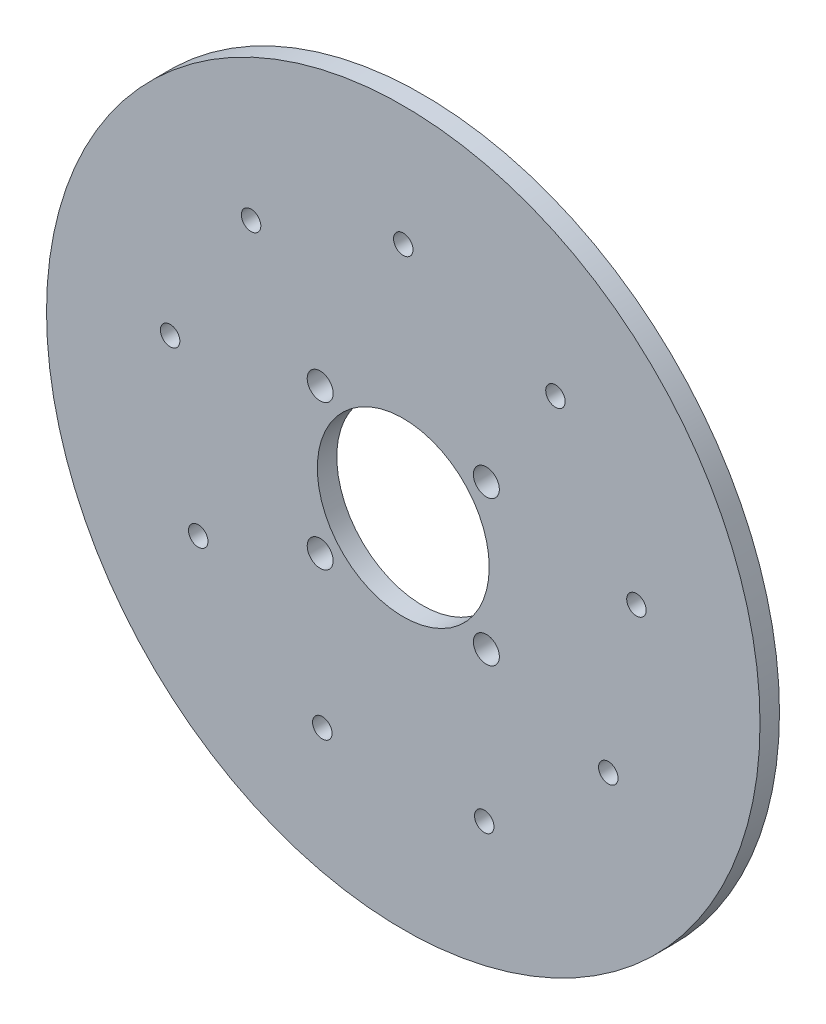
ISO-10303-21;
HEADER;
FILE_DESCRIPTION(('STEP AP214'),'2;1');
FILE_NAME('part.step','',(''),(''),'','','');
FILE_SCHEMA(('AUTOMOTIVE_DESIGN { 1 0 10303 214 1 1 1 1 }'));
ENDSEC;
DATA;
#1=APPLICATION_CONTEXT('core data for automotive mechanical design processes');
#2=APPLICATION_PROTOCOL_DEFINITION('international standard','automotive_design',2000,#1);
#3=PRODUCT_CONTEXT('',#1,'mechanical');
#4=PRODUCT('Part','Part','',(#3));
#5=PRODUCT_RELATED_PRODUCT_CATEGORY('part','',(#4));
#6=PRODUCT_DEFINITION_FORMATION('','',#4);
#7=PRODUCT_DEFINITION_CONTEXT('part definition',#1,'design');
#8=PRODUCT_DEFINITION('design','',#6,#7);
#9=PRODUCT_DEFINITION_SHAPE('','',#8);
#10=(LENGTH_UNIT() NAMED_UNIT(*) SI_UNIT(.MILLI.,.METRE.));
#11=(NAMED_UNIT(*) PLANE_ANGLE_UNIT() SI_UNIT($,.RADIAN.));
#12=(NAMED_UNIT(*) SI_UNIT($,.STERADIAN.) SOLID_ANGLE_UNIT());
#13=UNCERTAINTY_MEASURE_WITH_UNIT(LENGTH_MEASURE(1.E-05),#10,'distance_accuracy_value','');
#14=(GEOMETRIC_REPRESENTATION_CONTEXT(3) GLOBAL_UNCERTAINTY_ASSIGNED_CONTEXT((#13)) GLOBAL_UNIT_ASSIGNED_CONTEXT((#10,
#11,#12)) REPRESENTATION_CONTEXT('',''));
#15=CARTESIAN_POINT('',(0.,0.,0.));
#16=DIRECTION('',(0.,0.,1.));
#17=DIRECTION('',(1.,0.,0.));
#18=AXIS2_PLACEMENT_3D('',#15,#16,#17);
#19=CARTESIAN_POINT('',(0.,0.,3.));
#20=DIRECTION('',(0.,0.,1.));
#21=DIRECTION('',(1.,0.,0.));
#22=AXIS2_PLACEMENT_3D('',#19,#20,#21);
#23=PLANE('',#22);
#24=CARTESIAN_POINT('',(0.,0.,3.));
#25=DIRECTION('',(0.,0.,1.));
#26=DIRECTION('',(1.,0.,0.));
#27=AXIS2_PLACEMENT_3D('',#24,#25,#26);
#28=CIRCLE('',#27,13.25);
#29=CARTESIAN_POINT('',(13.25,0.,3.));
#30=VERTEX_POINT('',#29);
#31=EDGE_CURVE('E150',#30,#30,#28,.T.);
#32=ORIENTED_EDGE('',*,*,#31,.F.);
#33=EDGE_LOOP('',(#32));
#34=FACE_BOUND('',#33,.T.);
#35=CARTESIAN_POINT('',(12.8093502683551,11.1767860184667,3.));
#36=DIRECTION('',(0.,0.,1.));
#37=DIRECTION('',(-1.,0.,0.));
#38=AXIS2_PLACEMENT_3D('',#35,#36,#37);
#39=CIRCLE('',#38,2.);
#40=CARTESIAN_POINT('',(10.8093502683551,11.1767860184667,3.));
#41=VERTEX_POINT('',#40);
#42=EDGE_CURVE('E134',#41,#41,#39,.T.);
#43=ORIENTED_EDGE('',*,*,#42,.F.);
#44=EDGE_LOOP('',(#43));
#45=FACE_BOUND('',#44,.T.);
#46=CARTESIAN_POINT('',(-23.4617477535583,27.960622173843,3.));
#47=DIRECTION('',(0.,0.,1.));
#48=DIRECTION('',(1.,0.,0.));
#49=AXIS2_PLACEMENT_3D('',#46,#47,#48);
#50=CIRCLE('',#49,1.5);
#51=CARTESIAN_POINT('',(-21.9617477535583,27.960622173843,3.));
#52=VERTEX_POINT('',#51);
#53=EDGE_CURVE('E118',#52,#52,#50,.T.);
#54=ORIENTED_EDGE('',*,*,#53,.F.);
#55=EDGE_LOOP('',(#54));
#56=FACE_BOUND('',#55,.T.);
#57=CARTESIAN_POINT('',(-31.6099272381322,-18.2499999999997,3.));
#58=DIRECTION('',(0.,0.,1.));
#59=DIRECTION('',(1.,0.,0.));
#60=AXIS2_PLACEMENT_3D('',#57,#58,#59);
#61=CIRCLE('',#60,1.5);
#62=CARTESIAN_POINT('',(-30.1099272381322,-18.2499999999997,3.));
#63=VERTEX_POINT('',#62);
#64=EDGE_CURVE('E102',#63,#63,#61,.T.);
#65=ORIENTED_EDGE('',*,*,#64,.F.);
#66=EDGE_LOOP('',(#65));
#67=FACE_BOUND('',#66,.T.);
#68=CARTESIAN_POINT('',(12.4837352313867,-34.2987806586857,3.));
#69=DIRECTION('',(0.,0.,1.));
#70=DIRECTION('',(1.,0.,0.));
#71=AXIS2_PLACEMENT_3D('',#68,#69,#70);
#72=CIRCLE('',#71,1.5);
#73=CARTESIAN_POINT('',(13.9837352313867,-34.2987806586857,3.));
#74=VERTEX_POINT('',#73);
#75=EDGE_CURVE('E86',#74,#74,#72,.T.);
#76=ORIENTED_EDGE('',*,*,#75,.F.);
#77=EDGE_LOOP('',(#76));
#78=FACE_BOUND('',#77,.T.);
#79=CARTESIAN_POINT('',(35.9454829849456,6.33815848484285,3.));
#80=DIRECTION('',(0.,0.,1.));
#81=DIRECTION('',(1.,0.,0.));
#82=AXIS2_PLACEMENT_3D('',#79,#80,#81);
#83=CIRCLE('',#82,1.5);
#84=CARTESIAN_POINT('',(37.4454829849456,6.33815848484285,3.));
#85=VERTEX_POINT('',#84);
#86=EDGE_CURVE('E70',#85,#85,#83,.T.);
#87=ORIENTED_EDGE('',*,*,#86,.F.);
#88=EDGE_LOOP('',(#87));
#89=FACE_BOUND('',#88,.T.);
#90=CARTESIAN_POINT('',(0.,36.5,3.));
#91=DIRECTION('',(0.,0.,1.));
#92=DIRECTION('',(1.,0.,0.));
#93=AXIS2_PLACEMENT_3D('',#90,#91,#92);
#94=CIRCLE('',#93,1.5);
#95=CARTESIAN_POINT('',(1.5,36.5,3.));
#96=VERTEX_POINT('',#95);
#97=EDGE_CURVE('E56',#96,#96,#94,.T.);
#98=ORIENTED_EDGE('',*,*,#97,.F.);
#99=EDGE_LOOP('',(#98));
#100=FACE_BOUND('',#99,.T.);
#101=CARTESIAN_POINT('',(0.,0.,3.));
#102=DIRECTION('',(0.,0.,1.));
#103=DIRECTION('',(1.,0.,0.));
#104=AXIS2_PLACEMENT_3D('',#101,#102,#103);
#105=CIRCLE('',#104,55.);
#106=CARTESIAN_POINT('',(55.,0.,3.));
#107=VERTEX_POINT('',#106);
#108=EDGE_CURVE('E10',#107,#107,#105,.T.);
#109=ORIENTED_EDGE('',*,*,#108,.T.);
#110=EDGE_LOOP('',(#109));
#111=FACE_BOUND('',#110,.T.);
#112=CARTESIAN_POINT('',(23.4617477535587,27.9606221738427,3.));
#113=DIRECTION('',(0.,0.,1.));
#114=DIRECTION('',(1.,0.,0.));
#115=AXIS2_PLACEMENT_3D('',#112,#113,#114);
#116=CIRCLE('',#115,1.5);
#117=CARTESIAN_POINT('',(24.9617477535587,27.9606221738427,3.));
#118=VERTEX_POINT('',#117);
#119=EDGE_CURVE('E62',#118,#118,#116,.T.);
#120=ORIENTED_EDGE('',*,*,#119,.F.);
#121=EDGE_LOOP('',(#120));
#122=FACE_BOUND('',#121,.T.);
#123=CARTESIAN_POINT('',(31.6099272381319,-18.2500000000001,3.));
#124=DIRECTION('',(0.,0.,1.));
#125=DIRECTION('',(1.,0.,0.));
#126=AXIS2_PLACEMENT_3D('',#123,#124,#125);
#127=CIRCLE('',#126,1.5);
#128=CARTESIAN_POINT('',(33.1099272381319,-18.2500000000001,3.));
#129=VERTEX_POINT('',#128);
#130=EDGE_CURVE('E78',#129,#129,#127,.T.);
#131=ORIENTED_EDGE('',*,*,#130,.F.);
#132=EDGE_LOOP('',(#131));
#133=FACE_BOUND('',#132,.T.);
#134=CARTESIAN_POINT('',(-12.4837352313872,-34.2987806586856,3.));
#135=DIRECTION('',(0.,0.,1.));
#136=DIRECTION('',(1.,0.,0.));
#137=AXIS2_PLACEMENT_3D('',#134,#135,#136);
#138=CIRCLE('',#137,1.5);
#139=CARTESIAN_POINT('',(-10.9837352313872,-34.2987806586856,3.));
#140=VERTEX_POINT('',#139);
#141=EDGE_CURVE('E94',#140,#140,#138,.T.);
#142=ORIENTED_EDGE('',*,*,#141,.F.);
#143=EDGE_LOOP('',(#142));
#144=FACE_BOUND('',#143,.T.);
#145=CARTESIAN_POINT('',(-35.9454829849455,6.33815848484333,3.));
#146=DIRECTION('',(0.,0.,1.));
#147=DIRECTION('',(1.,0.,0.));
#148=AXIS2_PLACEMENT_3D('',#145,#146,#147);
#149=CIRCLE('',#148,1.5);
#150=CARTESIAN_POINT('',(-34.4454829849455,6.33815848484333,3.));
#151=VERTEX_POINT('',#150);
#152=EDGE_CURVE('E110',#151,#151,#149,.T.);
#153=ORIENTED_EDGE('',*,*,#152,.F.);
#154=EDGE_LOOP('',(#153));
#155=FACE_BOUND('',#154,.T.);
#156=CARTESIAN_POINT('',(-12.8093502683551,11.1767860184667,3.));
#157=DIRECTION('',(0.,0.,1.));
#158=DIRECTION('',(1.,0.,0.));
#159=AXIS2_PLACEMENT_3D('',#156,#157,#158);
#160=CIRCLE('',#159,2.);
#161=CARTESIAN_POINT('',(-10.8093502683551,11.1767860184667,3.));
#162=VERTEX_POINT('',#161);
#163=EDGE_CURVE('E126',#162,#162,#160,.T.);
#164=ORIENTED_EDGE('',*,*,#163,.F.);
#165=EDGE_LOOP('',(#164));
#166=FACE_BOUND('',#165,.T.);
#167=CARTESIAN_POINT('',(12.8093502683551,-11.1767860184667,3.));
#168=DIRECTION('',(0.,0.,1.));
#169=DIRECTION('',(1.,0.,0.));
#170=AXIS2_PLACEMENT_3D('',#167,#168,#169);
#171=CIRCLE('',#170,2.);
#172=CARTESIAN_POINT('',(14.8093502683551,-11.1767860184667,3.));
#173=VERTEX_POINT('',#172);
#174=EDGE_CURVE('E142',#173,#173,#171,.T.);
#175=ORIENTED_EDGE('',*,*,#174,.F.);
#176=EDGE_LOOP('',(#175));
#177=FACE_BOUND('',#176,.T.);
#178=CARTESIAN_POINT('',(-12.8093502683551,-11.1767860184667,3.));
#179=DIRECTION('',(0.,0.,1.));
#180=DIRECTION('',(-1.,0.,0.));
#181=AXIS2_PLACEMENT_3D('',#178,#179,#180);
#182=CIRCLE('',#181,2.);
#183=CARTESIAN_POINT('',(-14.8093502683551,-11.1767860184667,3.));
#184=VERTEX_POINT('',#183);
#185=EDGE_CURVE('E158',#184,#184,#182,.T.);
#186=ORIENTED_EDGE('',*,*,#185,.F.);
#187=EDGE_LOOP('',(#186));
#188=FACE_BOUND('',#187,.T.);
#189=ADVANCED_FACE('F43',(#34,#45,#56,#67,#78,#89,#100,#111,#122,#133,#144,#155,#166,#177,#188),
#23,.T.);
#190=CARTESIAN_POINT('',(0.,0.,0.));
#191=DIRECTION('',(0.,0.,1.));
#192=DIRECTION('',(1.,0.,0.));
#193=AXIS2_PLACEMENT_3D('',#190,#191,#192);
#194=PLANE('',#193);
#195=CARTESIAN_POINT('',(0.,0.,0.));
#196=DIRECTION('',(0.,0.,1.));
#197=DIRECTION('',(1.,0.,0.));
#198=AXIS2_PLACEMENT_3D('',#195,#196,#197);
#199=CIRCLE('',#198,55.);
#200=CARTESIAN_POINT('',(55.,0.,0.));
#201=VERTEX_POINT('',#200);
#202=EDGE_CURVE('E47',#201,#201,#199,.T.);
#203=ORIENTED_EDGE('',*,*,#202,.F.);
#204=EDGE_LOOP('',(#203));
#205=FACE_BOUND('',#204,.T.);
#206=CARTESIAN_POINT('',(0.,36.5,0.));
#207=DIRECTION('',(0.,0.,1.));
#208=DIRECTION('',(1.,0.,0.));
#209=AXIS2_PLACEMENT_3D('',#206,#207,#208);
#210=CIRCLE('',#209,1.5);
#211=CARTESIAN_POINT('',(1.5,36.5,0.));
#212=VERTEX_POINT('',#211);
#213=EDGE_CURVE('E58',#212,#212,#210,.T.);
#214=ORIENTED_EDGE('',*,*,#213,.T.);
#215=EDGE_LOOP('',(#214));
#216=FACE_BOUND('',#215,.T.);
#217=CARTESIAN_POINT('',(23.4617477535587,27.9606221738427,0.));
#218=DIRECTION('',(0.,0.,1.));
#219=DIRECTION('',(1.,0.,0.));
#220=AXIS2_PLACEMENT_3D('',#217,#218,#219);
#221=CIRCLE('',#220,1.5);
#222=CARTESIAN_POINT('',(24.9617477535587,27.9606221738427,0.));
#223=VERTEX_POINT('',#222);
#224=EDGE_CURVE('E66',#223,#223,#221,.T.);
#225=ORIENTED_EDGE('',*,*,#224,.T.);
#226=EDGE_LOOP('',(#225));
#227=FACE_BOUND('',#226,.T.);
#228=CARTESIAN_POINT('',(35.9454829849456,6.33815848484285,0.));
#229=DIRECTION('',(0.,0.,1.));
#230=DIRECTION('',(1.,0.,0.));
#231=AXIS2_PLACEMENT_3D('',#228,#229,#230);
#232=CIRCLE('',#231,1.5);
#233=CARTESIAN_POINT('',(37.4454829849456,6.33815848484285,0.));
#234=VERTEX_POINT('',#233);
#235=EDGE_CURVE('E74',#234,#234,#232,.T.);
#236=ORIENTED_EDGE('',*,*,#235,.T.);
#237=EDGE_LOOP('',(#236));
#238=FACE_BOUND('',#237,.T.);
#239=CARTESIAN_POINT('',(31.6099272381319,-18.2500000000001,0.));
#240=DIRECTION('',(0.,0.,1.));
#241=DIRECTION('',(1.,0.,0.));
#242=AXIS2_PLACEMENT_3D('',#239,#240,#241);
#243=CIRCLE('',#242,1.5);
#244=CARTESIAN_POINT('',(33.1099272381319,-18.2500000000001,0.));
#245=VERTEX_POINT('',#244);
#246=EDGE_CURVE('E82',#245,#245,#243,.T.);
#247=ORIENTED_EDGE('',*,*,#246,.T.);
#248=EDGE_LOOP('',(#247));
#249=FACE_BOUND('',#248,.T.);
#250=CARTESIAN_POINT('',(12.4837352313867,-34.2987806586857,0.));
#251=DIRECTION('',(0.,0.,1.));
#252=DIRECTION('',(1.,0.,0.));
#253=AXIS2_PLACEMENT_3D('',#250,#251,#252);
#254=CIRCLE('',#253,1.5);
#255=CARTESIAN_POINT('',(13.9837352313867,-34.2987806586857,0.));
#256=VERTEX_POINT('',#255);
#257=EDGE_CURVE('E90',#256,#256,#254,.T.);
#258=ORIENTED_EDGE('',*,*,#257,.T.);
#259=EDGE_LOOP('',(#258));
#260=FACE_BOUND('',#259,.T.);
#261=CARTESIAN_POINT('',(-12.4837352313872,-34.2987806586856,0.));
#262=DIRECTION('',(0.,0.,1.));
#263=DIRECTION('',(1.,0.,0.));
#264=AXIS2_PLACEMENT_3D('',#261,#262,#263);
#265=CIRCLE('',#264,1.5);
#266=CARTESIAN_POINT('',(-10.9837352313872,-34.2987806586856,0.));
#267=VERTEX_POINT('',#266);
#268=EDGE_CURVE('E98',#267,#267,#265,.T.);
#269=ORIENTED_EDGE('',*,*,#268,.T.);
#270=EDGE_LOOP('',(#269));
#271=FACE_BOUND('',#270,.T.);
#272=CARTESIAN_POINT('',(-31.6099272381322,-18.2499999999997,0.));
#273=DIRECTION('',(0.,0.,1.));
#274=DIRECTION('',(1.,0.,0.));
#275=AXIS2_PLACEMENT_3D('',#272,#273,#274);
#276=CIRCLE('',#275,1.5);
#277=CARTESIAN_POINT('',(-30.1099272381322,-18.2499999999997,0.));
#278=VERTEX_POINT('',#277);
#279=EDGE_CURVE('E106',#278,#278,#276,.T.);
#280=ORIENTED_EDGE('',*,*,#279,.T.);
#281=EDGE_LOOP('',(#280));
#282=FACE_BOUND('',#281,.T.);
#283=CARTESIAN_POINT('',(-35.9454829849455,6.33815848484333,0.));
#284=DIRECTION('',(0.,0.,1.));
#285=DIRECTION('',(1.,0.,0.));
#286=AXIS2_PLACEMENT_3D('',#283,#284,#285);
#287=CIRCLE('',#286,1.5);
#288=CARTESIAN_POINT('',(-34.4454829849455,6.33815848484333,0.));
#289=VERTEX_POINT('',#288);
#290=EDGE_CURVE('E114',#289,#289,#287,.T.);
#291=ORIENTED_EDGE('',*,*,#290,.T.);
#292=EDGE_LOOP('',(#291));
#293=FACE_BOUND('',#292,.T.);
#294=CARTESIAN_POINT('',(-23.4617477535583,27.960622173843,0.));
#295=DIRECTION('',(0.,0.,1.));
#296=DIRECTION('',(1.,0.,0.));
#297=AXIS2_PLACEMENT_3D('',#294,#295,#296);
#298=CIRCLE('',#297,1.5);
#299=CARTESIAN_POINT('',(-21.9617477535583,27.960622173843,0.));
#300=VERTEX_POINT('',#299);
#301=EDGE_CURVE('E122',#300,#300,#298,.T.);
#302=ORIENTED_EDGE('',*,*,#301,.T.);
#303=EDGE_LOOP('',(#302));
#304=FACE_BOUND('',#303,.T.);
#305=CARTESIAN_POINT('',(-12.8093502683551,11.1767860184667,0.));
#306=DIRECTION('',(0.,0.,1.));
#307=DIRECTION('',(1.,0.,0.));
#308=AXIS2_PLACEMENT_3D('',#305,#306,#307);
#309=CIRCLE('',#308,2.);
#310=CARTESIAN_POINT('',(-10.8093502683551,11.1767860184667,0.));
#311=VERTEX_POINT('',#310);
#312=EDGE_CURVE('E130',#311,#311,#309,.T.);
#313=ORIENTED_EDGE('',*,*,#312,.T.);
#314=EDGE_LOOP('',(#313));
#315=FACE_BOUND('',#314,.T.);
#316=CARTESIAN_POINT('',(12.8093502683551,11.1767860184667,0.));
#317=DIRECTION('',(0.,0.,1.));
#318=DIRECTION('',(-1.,0.,0.));
#319=AXIS2_PLACEMENT_3D('',#316,#317,#318);
#320=CIRCLE('',#319,2.);
#321=CARTESIAN_POINT('',(10.8093502683551,11.1767860184667,0.));
#322=VERTEX_POINT('',#321);
#323=EDGE_CURVE('E138',#322,#322,#320,.T.);
#324=ORIENTED_EDGE('',*,*,#323,.T.);
#325=EDGE_LOOP('',(#324));
#326=FACE_BOUND('',#325,.T.);
#327=CARTESIAN_POINT('',(12.8093502683551,-11.1767860184667,0.));
#328=DIRECTION('',(0.,0.,1.));
#329=DIRECTION('',(1.,0.,0.));
#330=AXIS2_PLACEMENT_3D('',#327,#328,#329);
#331=CIRCLE('',#330,2.);
#332=CARTESIAN_POINT('',(14.8093502683551,-11.1767860184667,0.));
#333=VERTEX_POINT('',#332);
#334=EDGE_CURVE('E146',#333,#333,#331,.T.);
#335=ORIENTED_EDGE('',*,*,#334,.T.);
#336=EDGE_LOOP('',(#335));
#337=FACE_BOUND('',#336,.T.);
#338=CARTESIAN_POINT('',(0.,0.,0.));
#339=DIRECTION('',(0.,0.,1.));
#340=DIRECTION('',(1.,0.,0.));
#341=AXIS2_PLACEMENT_3D('',#338,#339,#340);
#342=CIRCLE('',#341,13.25);
#343=CARTESIAN_POINT('',(13.25,0.,0.));
#344=VERTEX_POINT('',#343);
#345=EDGE_CURVE('E154',#344,#344,#342,.T.);
#346=ORIENTED_EDGE('',*,*,#345,.T.);
#347=EDGE_LOOP('',(#346));
#348=FACE_BOUND('',#347,.T.);
#349=CARTESIAN_POINT('',(-12.8093502683551,-11.1767860184667,0.));
#350=DIRECTION('',(0.,0.,1.));
#351=DIRECTION('',(-1.,0.,0.));
#352=AXIS2_PLACEMENT_3D('',#349,#350,#351);
#353=CIRCLE('',#352,2.);
#354=CARTESIAN_POINT('',(-14.8093502683551,-11.1767860184667,0.));
#355=VERTEX_POINT('',#354);
#356=EDGE_CURVE('E162',#355,#355,#353,.T.);
#357=ORIENTED_EDGE('',*,*,#356,.T.);
#358=EDGE_LOOP('',(#357));
#359=FACE_BOUND('',#358,.T.);
#360=ADVANCED_FACE('F174',(#205,#216,#227,#238,#249,#260,#271,#282,#293,#304,#315,#326,#337,
#348,#359),#194,.F.);
#361=CARTESIAN_POINT('',(0.,0.,3.));
#362=DIRECTION('',(0.,0.,-1.));
#363=DIRECTION('',(-1.,0.,0.));
#364=AXIS2_PLACEMENT_3D('',#361,#362,#363);
#365=CYLINDRICAL_SURFACE('',#364,55.);
#366=ORIENTED_EDGE('',*,*,#108,.F.);
#367=EDGE_LOOP('',(#366));
#368=FACE_BOUND('',#367,.T.);
#369=ORIENTED_EDGE('',*,*,#202,.T.);
#370=EDGE_LOOP('',(#369));
#371=FACE_BOUND('',#370,.T.);
#372=ADVANCED_FACE('F45',(#368,#371),#365,.T.);
#373=CARTESIAN_POINT('',(0.,36.5,3.));
#374=DIRECTION('',(0.,0.,-1.));
#375=DIRECTION('',(-1.,0.,0.));
#376=AXIS2_PLACEMENT_3D('',#373,#374,#375);
#377=CYLINDRICAL_SURFACE('',#376,1.5);
#378=ORIENTED_EDGE('',*,*,#97,.T.);
#379=EDGE_LOOP('',(#378));
#380=FACE_BOUND('',#379,.T.);
#381=ORIENTED_EDGE('',*,*,#213,.F.);
#382=EDGE_LOOP('',(#381));
#383=FACE_BOUND('',#382,.T.);
#384=ADVANCED_FACE('F184',(#380,#383),#377,.F.);
#385=CARTESIAN_POINT('',(23.4617477535587,27.9606221738427,3.));
#386=DIRECTION('',(0.,0.,-1.));
#387=DIRECTION('',(-1.,0.,0.));
#388=AXIS2_PLACEMENT_3D('',#385,#386,#387);
#389=CYLINDRICAL_SURFACE('',#388,1.5);
#390=ORIENTED_EDGE('',*,*,#119,.T.);
#391=EDGE_LOOP('',(#390));
#392=FACE_BOUND('',#391,.T.);
#393=ORIENTED_EDGE('',*,*,#224,.F.);
#394=EDGE_LOOP('',(#393));
#395=FACE_BOUND('',#394,.T.);
#396=ADVANCED_FACE('F187',(#392,#395),#389,.F.);
#397=CARTESIAN_POINT('',(35.9454829849456,6.33815848484285,3.));
#398=DIRECTION('',(0.,0.,-1.));
#399=DIRECTION('',(-1.,0.,0.));
#400=AXIS2_PLACEMENT_3D('',#397,#398,#399);
#401=CYLINDRICAL_SURFACE('',#400,1.5);
#402=ORIENTED_EDGE('',*,*,#86,.T.);
#403=EDGE_LOOP('',(#402));
#404=FACE_BOUND('',#403,.T.);
#405=ORIENTED_EDGE('',*,*,#235,.F.);
#406=EDGE_LOOP('',(#405));
#407=FACE_BOUND('',#406,.T.);
#408=ADVANCED_FACE('F191',(#404,#407),#401,.F.);
#409=CARTESIAN_POINT('',(31.6099272381319,-18.2500000000001,3.));
#410=DIRECTION('',(0.,0.,-1.));
#411=DIRECTION('',(-1.,0.,0.));
#412=AXIS2_PLACEMENT_3D('',#409,#410,#411);
#413=CYLINDRICAL_SURFACE('',#412,1.5);
#414=ORIENTED_EDGE('',*,*,#130,.T.);
#415=EDGE_LOOP('',(#414));
#416=FACE_BOUND('',#415,.T.);
#417=ORIENTED_EDGE('',*,*,#246,.F.);
#418=EDGE_LOOP('',(#417));
#419=FACE_BOUND('',#418,.T.);
#420=ADVANCED_FACE('F195',(#416,#419),#413,.F.);
#421=CARTESIAN_POINT('',(12.4837352313867,-34.2987806586857,3.));
#422=DIRECTION('',(0.,0.,-1.));
#423=DIRECTION('',(-1.,0.,0.));
#424=AXIS2_PLACEMENT_3D('',#421,#422,#423);
#425=CYLINDRICAL_SURFACE('',#424,1.5);
#426=ORIENTED_EDGE('',*,*,#75,.T.);
#427=EDGE_LOOP('',(#426));
#428=FACE_BOUND('',#427,.T.);
#429=ORIENTED_EDGE('',*,*,#257,.F.);
#430=EDGE_LOOP('',(#429));
#431=FACE_BOUND('',#430,.T.);
#432=ADVANCED_FACE('F199',(#428,#431),#425,.F.);
#433=CARTESIAN_POINT('',(-12.4837352313872,-34.2987806586856,3.));
#434=DIRECTION('',(0.,0.,-1.));
#435=DIRECTION('',(-1.,0.,0.));
#436=AXIS2_PLACEMENT_3D('',#433,#434,#435);
#437=CYLINDRICAL_SURFACE('',#436,1.5);
#438=ORIENTED_EDGE('',*,*,#141,.T.);
#439=EDGE_LOOP('',(#438));
#440=FACE_BOUND('',#439,.T.);
#441=ORIENTED_EDGE('',*,*,#268,.F.);
#442=EDGE_LOOP('',(#441));
#443=FACE_BOUND('',#442,.T.);
#444=ADVANCED_FACE('F203',(#440,#443),#437,.F.);
#445=CARTESIAN_POINT('',(-31.6099272381322,-18.2499999999997,3.));
#446=DIRECTION('',(0.,0.,-1.));
#447=DIRECTION('',(-1.,0.,0.));
#448=AXIS2_PLACEMENT_3D('',#445,#446,#447);
#449=CYLINDRICAL_SURFACE('',#448,1.5);
#450=ORIENTED_EDGE('',*,*,#64,.T.);
#451=EDGE_LOOP('',(#450));
#452=FACE_BOUND('',#451,.T.);
#453=ORIENTED_EDGE('',*,*,#279,.F.);
#454=EDGE_LOOP('',(#453));
#455=FACE_BOUND('',#454,.T.);
#456=ADVANCED_FACE('F207',(#452,#455),#449,.F.);
#457=CARTESIAN_POINT('',(-35.9454829849455,6.33815848484333,3.));
#458=DIRECTION('',(0.,0.,-1.));
#459=DIRECTION('',(-1.,0.,0.));
#460=AXIS2_PLACEMENT_3D('',#457,#458,#459);
#461=CYLINDRICAL_SURFACE('',#460,1.5);
#462=ORIENTED_EDGE('',*,*,#152,.T.);
#463=EDGE_LOOP('',(#462));
#464=FACE_BOUND('',#463,.T.);
#465=ORIENTED_EDGE('',*,*,#290,.F.);
#466=EDGE_LOOP('',(#465));
#467=FACE_BOUND('',#466,.T.);
#468=ADVANCED_FACE('F211',(#464,#467),#461,.F.);
#469=CARTESIAN_POINT('',(-23.4617477535583,27.960622173843,3.));
#470=DIRECTION('',(0.,0.,-1.));
#471=DIRECTION('',(-1.,0.,0.));
#472=AXIS2_PLACEMENT_3D('',#469,#470,#471);
#473=CYLINDRICAL_SURFACE('',#472,1.5);
#474=ORIENTED_EDGE('',*,*,#53,.T.);
#475=EDGE_LOOP('',(#474));
#476=FACE_BOUND('',#475,.T.);
#477=ORIENTED_EDGE('',*,*,#301,.F.);
#478=EDGE_LOOP('',(#477));
#479=FACE_BOUND('',#478,.T.);
#480=ADVANCED_FACE('F215',(#476,#479),#473,.F.);
#481=CARTESIAN_POINT('',(-12.8093502683551,11.1767860184667,3.));
#482=DIRECTION('',(0.,0.,-1.));
#483=DIRECTION('',(-1.,0.,0.));
#484=AXIS2_PLACEMENT_3D('',#481,#482,#483);
#485=CYLINDRICAL_SURFACE('',#484,2.);
#486=ORIENTED_EDGE('',*,*,#163,.T.);
#487=EDGE_LOOP('',(#486));
#488=FACE_BOUND('',#487,.T.);
#489=ORIENTED_EDGE('',*,*,#312,.F.);
#490=EDGE_LOOP('',(#489));
#491=FACE_BOUND('',#490,.T.);
#492=ADVANCED_FACE('F219',(#488,#491),#485,.F.);
#493=CARTESIAN_POINT('',(12.8093502683551,11.1767860184667,3.));
#494=DIRECTION('',(0.,0.,-1.));
#495=DIRECTION('',(-1.,0.,0.));
#496=AXIS2_PLACEMENT_3D('',#493,#494,#495);
#497=CYLINDRICAL_SURFACE('',#496,2.);
#498=ORIENTED_EDGE('',*,*,#42,.T.);
#499=EDGE_LOOP('',(#498));
#500=FACE_BOUND('',#499,.T.);
#501=ORIENTED_EDGE('',*,*,#323,.F.);
#502=EDGE_LOOP('',(#501));
#503=FACE_BOUND('',#502,.T.);
#504=ADVANCED_FACE('F223',(#500,#503),#497,.F.);
#505=CARTESIAN_POINT('',(12.8093502683551,-11.1767860184667,3.));
#506=DIRECTION('',(0.,0.,-1.));
#507=DIRECTION('',(-1.,0.,0.));
#508=AXIS2_PLACEMENT_3D('',#505,#506,#507);
#509=CYLINDRICAL_SURFACE('',#508,2.);
#510=ORIENTED_EDGE('',*,*,#174,.T.);
#511=EDGE_LOOP('',(#510));
#512=FACE_BOUND('',#511,.T.);
#513=ORIENTED_EDGE('',*,*,#334,.F.);
#514=EDGE_LOOP('',(#513));
#515=FACE_BOUND('',#514,.T.);
#516=ADVANCED_FACE('F227',(#512,#515),#509,.F.);
#517=CARTESIAN_POINT('',(0.,0.,3.));
#518=DIRECTION('',(0.,0.,-1.));
#519=DIRECTION('',(-1.,0.,0.));
#520=AXIS2_PLACEMENT_3D('',#517,#518,#519);
#521=CYLINDRICAL_SURFACE('',#520,13.25);
#522=ORIENTED_EDGE('',*,*,#31,.T.);
#523=EDGE_LOOP('',(#522));
#524=FACE_BOUND('',#523,.T.);
#525=ORIENTED_EDGE('',*,*,#345,.F.);
#526=EDGE_LOOP('',(#525));
#527=FACE_BOUND('',#526,.T.);
#528=ADVANCED_FACE('F231',(#524,#527),#521,.F.);
#529=CARTESIAN_POINT('',(-12.8093502683551,-11.1767860184667,3.));
#530=DIRECTION('',(0.,0.,-1.));
#531=DIRECTION('',(-1.,0.,0.));
#532=AXIS2_PLACEMENT_3D('',#529,#530,#531);
#533=CYLINDRICAL_SURFACE('',#532,2.);
#534=ORIENTED_EDGE('',*,*,#185,.T.);
#535=EDGE_LOOP('',(#534));
#536=FACE_BOUND('',#535,.T.);
#537=ORIENTED_EDGE('',*,*,#356,.F.);
#538=EDGE_LOOP('',(#537));
#539=FACE_BOUND('',#538,.T.);
#540=ADVANCED_FACE('F170',(#536,#539),#533,.F.);
#541=CLOSED_SHELL('',(#189,#360,#372,#384,#396,#408,#420,#432,#444,#456,#468,#480,#492,#504,
#516,#528,#540));
#542=MANIFOLD_SOLID_BREP('B2',#541);
#543=ADVANCED_BREP_SHAPE_REPRESENTATION('',(#18,#542),#14);
#544=SHAPE_DEFINITION_REPRESENTATION(#9,#543);
ENDSEC;
END-ISO-10303-21;
